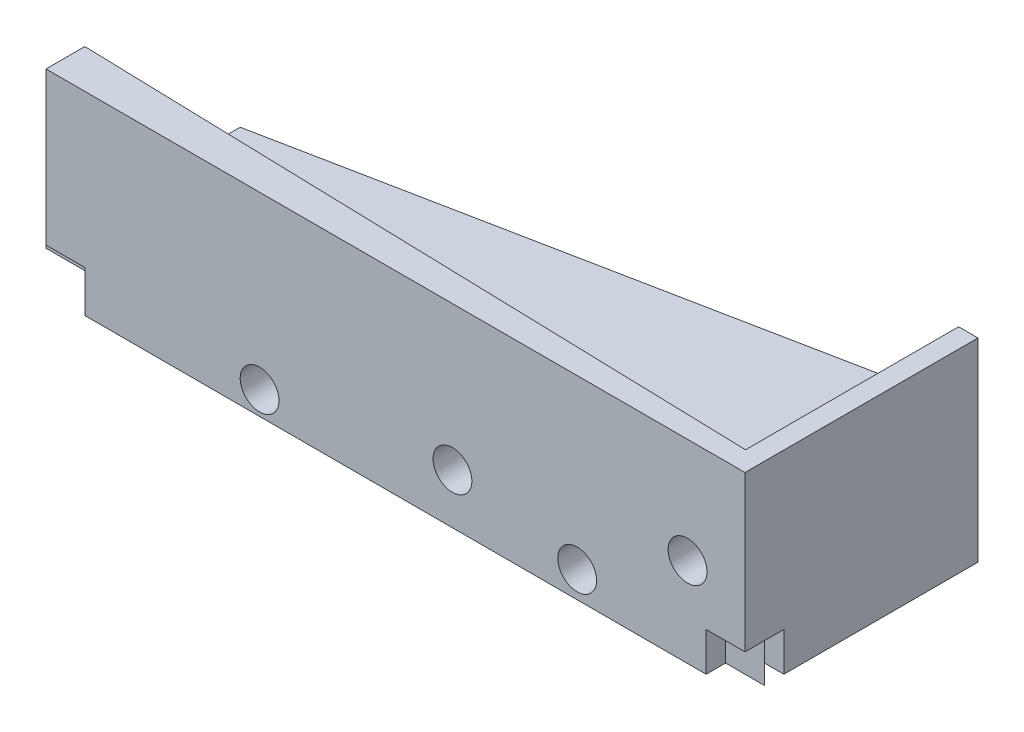
ISO-10303-21;
HEADER;
FILE_DESCRIPTION(('STEP AP214'),'2;1');
FILE_NAME('part.step','',(''),(''),'','','');
FILE_SCHEMA(('AUTOMOTIVE_DESIGN { 1 0 10303 214 1 1 1 1 }'));
ENDSEC;
DATA;
#1=APPLICATION_CONTEXT('core data for automotive mechanical design processes');
#2=APPLICATION_PROTOCOL_DEFINITION('international standard','automotive_design',2000,#1);
#3=PRODUCT_CONTEXT('',#1,'mechanical');
#4=PRODUCT('Part','Part','',(#3));
#5=PRODUCT_RELATED_PRODUCT_CATEGORY('part','',(#4));
#6=PRODUCT_DEFINITION_FORMATION('','',#4);
#7=PRODUCT_DEFINITION_CONTEXT('part definition',#1,'design');
#8=PRODUCT_DEFINITION('design','',#6,#7);
#9=PRODUCT_DEFINITION_SHAPE('','',#8);
#10=(LENGTH_UNIT() NAMED_UNIT(*) SI_UNIT(.MILLI.,.METRE.));
#11=(NAMED_UNIT(*) PLANE_ANGLE_UNIT() SI_UNIT($,.RADIAN.));
#12=(NAMED_UNIT(*) SI_UNIT($,.STERADIAN.) SOLID_ANGLE_UNIT());
#13=UNCERTAINTY_MEASURE_WITH_UNIT(LENGTH_MEASURE(1.E-05),#10,'distance_accuracy_value','');
#14=(GEOMETRIC_REPRESENTATION_CONTEXT(3) GLOBAL_UNCERTAINTY_ASSIGNED_CONTEXT((#13)) GLOBAL_UNIT_ASSIGNED_CONTEXT((#10,
#11,#12)) REPRESENTATION_CONTEXT('',''));
#15=CARTESIAN_POINT('',(0.,0.,0.));
#16=DIRECTION('',(0.,0.,1.));
#17=DIRECTION('',(1.,0.,0.));
#18=AXIS2_PLACEMENT_3D('',#15,#16,#17);
#19=CARTESIAN_POINT('',(-40.7960134047091,6.,200.));
#20=DIRECTION('',(0.,0.,-1.));
#21=DIRECTION('',(-1.,0.,0.));
#22=AXIS2_PLACEMENT_3D('',#19,#20,#21);
#23=CYLINDRICAL_SURFACE('',#22,3.);
#24=CARTESIAN_POINT('',(-40.7960134047091,6.,145.));
#25=DIRECTION('',(0.,0.,1.));
#26=DIRECTION('',(1.,0.,0.));
#27=AXIS2_PLACEMENT_3D('',#24,#25,#26);
#28=CIRCLE('',#27,3.);
#29=CARTESIAN_POINT('',(-37.7960134047091,6.,145.));
#30=VERTEX_POINT('',#29);
#31=EDGE_CURVE('E363',#30,#30,#28,.T.);
#32=ORIENTED_EDGE('',*,*,#31,.F.);
#33=EDGE_LOOP('',(#32));
#34=FACE_BOUND('',#33,.T.);
#35=CARTESIAN_POINT('',(-40.7960134047091,6.,190.));
#36=DIRECTION('',(0.,0.,1.));
#37=DIRECTION('',(1.,0.,0.));
#38=AXIS2_PLACEMENT_3D('',#35,#36,#37);
#39=CIRCLE('',#38,3.);
#40=CARTESIAN_POINT('',(-37.7960134047091,6.,190.));
#41=VERTEX_POINT('',#40);
#42=EDGE_CURVE('E217',#41,#41,#39,.T.);
#43=ORIENTED_EDGE('',*,*,#42,.T.);
#44=EDGE_LOOP('',(#43));
#45=FACE_BOUND('',#44,.T.);
#46=ADVANCED_FACE('F35',(#34,#45),#23,.F.);
#47=CARTESIAN_POINT('',(8.86154286614935,12.9010851063287,200.));
#48=DIRECTION('',(0.,0.,-1.));
#49=DIRECTION('',(-1.,0.,0.));
#50=AXIS2_PLACEMENT_3D('',#47,#48,#49);
#51=CYLINDRICAL_SURFACE('',#50,3.);
#52=CARTESIAN_POINT('',(8.86154286614935,12.9010851063287,145.));
#53=DIRECTION('',(0.,0.,1.));
#54=DIRECTION('',(1.,0.,0.));
#55=AXIS2_PLACEMENT_3D('',#52,#53,#54);
#56=CIRCLE('',#55,3.);
#57=CARTESIAN_POINT('',(11.8615428661494,12.9010851063287,145.));
#58=VERTEX_POINT('',#57);
#59=EDGE_CURVE('E360',#58,#58,#56,.T.);
#60=ORIENTED_EDGE('',*,*,#59,.F.);
#61=EDGE_LOOP('',(#60));
#62=FACE_BOUND('',#61,.T.);
#63=CARTESIAN_POINT('',(8.86154286614935,12.9010851063287,190.));
#64=DIRECTION('',(0.,0.,1.));
#65=DIRECTION('',(1.,0.,0.));
#66=AXIS2_PLACEMENT_3D('',#63,#64,#65);
#67=CIRCLE('',#66,3.);
#68=CARTESIAN_POINT('',(11.8615428661494,12.9010851063287,190.));
#69=VERTEX_POINT('',#68);
#70=EDGE_CURVE('E212',#69,#69,#67,.T.);
#71=ORIENTED_EDGE('',*,*,#70,.T.);
#72=EDGE_LOOP('',(#71));
#73=FACE_BOUND('',#72,.T.);
#74=ADVANCED_FACE('F403',(#62,#73),#51,.F.);
#75=CARTESIAN_POINT('',(40.9814690667464,6.77616521020496,200.));
#76=DIRECTION('',(0.,0.,-1.));
#77=DIRECTION('',(-1.,0.,0.));
#78=AXIS2_PLACEMENT_3D('',#75,#76,#77);
#79=CYLINDRICAL_SURFACE('',#78,3.00000000000001);
#80=CARTESIAN_POINT('',(40.9814690667464,6.77616521020496,145.));
#81=DIRECTION('',(0.,0.,1.));
#82=DIRECTION('',(1.,0.,0.));
#83=AXIS2_PLACEMENT_3D('',#80,#81,#82);
#84=CIRCLE('',#83,3.00000000000001);
#85=CARTESIAN_POINT('',(43.9814690667464,6.77616521020496,145.));
#86=VERTEX_POINT('',#85);
#87=EDGE_CURVE('E353',#86,#86,#84,.T.);
#88=ORIENTED_EDGE('',*,*,#87,.F.);
#89=EDGE_LOOP('',(#88));
#90=FACE_BOUND('',#89,.T.);
#91=CARTESIAN_POINT('',(40.9814690667464,6.77616521020496,190.));
#92=DIRECTION('',(0.,0.,1.));
#93=DIRECTION('',(1.,0.,0.));
#94=AXIS2_PLACEMENT_3D('',#91,#92,#93);
#95=CIRCLE('',#94,3.00000000000001);
#96=CARTESIAN_POINT('',(43.9814690667464,6.77616521020496,190.));
#97=VERTEX_POINT('',#96);
#98=EDGE_CURVE('E207',#97,#97,#95,.T.);
#99=ORIENTED_EDGE('',*,*,#98,.T.);
#100=EDGE_LOOP('',(#99));
#101=FACE_BOUND('',#100,.T.);
#102=ADVANCED_FACE('F410',(#90,#101),#79,.F.);
#103=CARTESIAN_POINT('',(69.4060048708337,22.9393971638675,200.));
#104=DIRECTION('',(0.,0.,-1.));
#105=DIRECTION('',(-1.,0.,0.));
#106=AXIS2_PLACEMENT_3D('',#103,#104,#105);
#107=CYLINDRICAL_SURFACE('',#106,3.00000000000001);
#108=CARTESIAN_POINT('',(69.4060048708337,22.9393971638675,145.));
#109=DIRECTION('',(0.,0.,1.));
#110=DIRECTION('',(1.,0.,0.));
#111=AXIS2_PLACEMENT_3D('',#108,#109,#110);
#112=CIRCLE('',#111,3.00000000000001);
#113=CARTESIAN_POINT('',(72.4060048708337,22.9393971638675,145.));
#114=VERTEX_POINT('',#113);
#115=EDGE_CURVE('E350',#114,#114,#112,.T.);
#116=ORIENTED_EDGE('',*,*,#115,.F.);
#117=EDGE_LOOP('',(#116));
#118=FACE_BOUND('',#117,.T.);
#119=CARTESIAN_POINT('',(69.4060048708337,22.9393971638675,190.));
#120=DIRECTION('',(0.,0.,1.));
#121=DIRECTION('',(1.,0.,0.));
#122=AXIS2_PLACEMENT_3D('',#119,#120,#121);
#123=CIRCLE('',#122,3.00000000000001);
#124=CARTESIAN_POINT('',(72.4060048708337,22.9393971638675,190.));
#125=VERTEX_POINT('',#124);
#126=EDGE_CURVE('E202',#125,#125,#123,.T.);
#127=ORIENTED_EDGE('',*,*,#126,.T.);
#128=EDGE_LOOP('',(#127));
#129=FACE_BOUND('',#128,.T.);
#130=ADVANCED_FACE('F419',(#118,#129),#107,.F.);
#131=CARTESIAN_POINT('',(-105.796013404709,2.,200.));
#132=DIRECTION('',(0.163567680624933,-0.986532114963816,0.));
#133=DIRECTION('',(0.986532114963816,0.163567680624933,0.));
#134=AXIS2_PLACEMENT_3D('',#131,#132,#133);
#135=PLANE('',#134);
#136=DIRECTION('',(0.,0.,-1.));
#137=VECTOR('',#136,1.);
#138=CARTESIAN_POINT('',(79.2039865952909,32.6731230100121,217.967909160371));
#139=LINE('',#138,#137);
#140=CARTESIAN_POINT('',(79.2039865952909,32.6731230100121,199.861111111111));
#141=VERTEX_POINT('',#140);
#142=CARTESIAN_POINT('',(79.2039865952909,32.6731230100121,145.));
#143=VERTEX_POINT('',#142);
#144=EDGE_CURVE('E349',#141,#143,#139,.T.);
#145=ORIENTED_EDGE('',*,*,#144,.T.);
#146=DIRECTION('',(-0.986532114963816,-0.163567680624933,0.));
#147=VECTOR('',#146,1.);
#148=CARTESIAN_POINT('',(-105.796013404709,2.,145.));
#149=LINE('',#148,#147);
#150=CARTESIAN_POINT('',(-105.796013404709,2.,145.));
#151=VERTEX_POINT('',#150);
#152=EDGE_CURVE('E49',#143,#151,#149,.T.);
#153=ORIENTED_EDGE('',*,*,#152,.T.);
#154=DIRECTION('',(0.,0.,-1.));
#155=VECTOR('',#154,1.);
#156=CARTESIAN_POINT('',(-105.796013404709,2.,200.));
#157=LINE('',#156,#155);
#158=CARTESIAN_POINT('',(-105.796013404709,2.,195.));
#159=VERTEX_POINT('',#158);
#160=EDGE_CURVE('E191',#159,#151,#157,.T.);
#161=ORIENTED_EDGE('',*,*,#160,.F.);
#162=DIRECTION('',(-0.986532114963816,-0.163567680624933,0.));
#163=VECTOR('',#162,1.);
#164=CARTESIAN_POINT('',(-105.796013404709,2.,195.));
#165=LINE('',#164,#163);
#166=CARTESIAN_POINT('',(-85.7960134047091,5.31601329837969,195.));
#167=VERTEX_POINT('',#166);
#168=EDGE_CURVE('E278',#167,#159,#165,.T.);
#169=ORIENTED_EDGE('',*,*,#168,.F.);
#170=DIRECTION('',(0.,0.,-1.));
#171=VECTOR('',#170,1.);
#172=CARTESIAN_POINT('',(-85.7960134047091,5.31601329837969,200.));
#173=LINE('',#172,#171);
#174=CARTESIAN_POINT('',(-85.7960134047091,5.31601329837969,195.277777777778));
#175=VERTEX_POINT('',#174);
#176=EDGE_CURVE('E274',#175,#167,#173,.T.);
#177=ORIENTED_EDGE('',*,*,#176,.F.);
#178=DIRECTION('',(-0.986161899831777,-0.163506298709877,-0.0273933861064383));
#179=VECTOR('',#178,1.);
#180=CARTESIAN_POINT('',(-105.653437860258,2.02363912007125,194.726182654013));
#181=LINE('',#180,#179);
#182=EDGE_CURVE('E221',#141,#175,#181,.T.);
#183=ORIENTED_EDGE('',*,*,#182,.F.);
#184=EDGE_LOOP('',(#145,#153,#161,#169,#177,#183));
#185=FACE_BOUND('',#184,.T.);
#186=ADVANCED_FACE('F347',(#185),#135,.F.);
#187=CARTESIAN_POINT('',(-105.796013404709,0.,200.));
#188=DIRECTION('',(1.,0.,0.));
#189=DIRECTION('',(0.,0.,-1.));
#190=AXIS2_PLACEMENT_3D('',#187,#188,#189);
#191=PLANE('',#190);
#192=ORIENTED_EDGE('',*,*,#160,.T.);
#193=DIRECTION('',(0.,1.,0.));
#194=VECTOR('',#193,1.);
#195=CARTESIAN_POINT('',(-105.796013404709,-242.074368738204,145.));
#196=LINE('',#195,#194);
#197=CARTESIAN_POINT('',(-105.796013404709,0.,145.));
#198=VERTEX_POINT('',#197);
#199=EDGE_CURVE('E160',#198,#151,#196,.T.);
#200=ORIENTED_EDGE('',*,*,#199,.F.);
#201=DIRECTION('',(0.,0.,-1.));
#202=VECTOR('',#201,1.);
#203=CARTESIAN_POINT('',(-105.796013404709,0.,200.));
#204=LINE('',#203,#202);
#205=CARTESIAN_POINT('',(-105.796013404709,0.,195.));
#206=VERTEX_POINT('',#205);
#207=EDGE_CURVE('E196',#206,#198,#204,.T.);
#208=ORIENTED_EDGE('',*,*,#207,.F.);
#209=DIRECTION('',(0.,1.,0.));
#210=VECTOR('',#209,1.);
#211=CARTESIAN_POINT('',(-105.796013404709,0.,195.));
#212=LINE('',#211,#210);
#213=EDGE_CURVE('E339',#206,#159,#212,.T.);
#214=ORIENTED_EDGE('',*,*,#213,.T.);
#215=EDGE_LOOP('',(#192,#200,#208,#214));
#216=FACE_BOUND('',#215,.T.);
#217=ADVANCED_FACE('F37',(#216),#191,.F.);
#218=CARTESIAN_POINT('',(-105.796013404709,0.,200.));
#219=DIRECTION('',(0.,1.,0.));
#220=DIRECTION('',(0.,0.,1.));
#221=AXIS2_PLACEMENT_3D('',#218,#219,#220);
#222=PLANE('',#221);
#223=ORIENTED_EDGE('',*,*,#207,.T.);
#224=DIRECTION('',(-1.,0.,0.));
#225=VECTOR('',#224,1.);
#226=CARTESIAN_POINT('',(84.2039865952909,0.,145.));
#227=LINE('',#226,#225);
#228=CARTESIAN_POINT('',(84.2039865952909,0.,145.));
#229=VERTEX_POINT('',#228);
#230=EDGE_CURVE('E171',#229,#198,#227,.T.);
#231=ORIENTED_EDGE('',*,*,#230,.F.);
#232=DIRECTION('',(0.,0.,-1.));
#233=VECTOR('',#232,1.);
#234=CARTESIAN_POINT('',(84.2039865952909,0.,200.));
#235=LINE('',#234,#233);
#236=CARTESIAN_POINT('',(84.2039865952909,0.,195.));
#237=VERTEX_POINT('',#236);
#238=EDGE_CURVE('E170',#237,#229,#235,.T.);
#239=ORIENTED_EDGE('',*,*,#238,.F.);
#240=DIRECTION('',(1.,0.,0.));
#241=VECTOR('',#240,1.);
#242=CARTESIAN_POINT('',(74.2039865952909,0.,195.));
#243=LINE('',#242,#241);
#244=CARTESIAN_POINT('',(74.2039865952909,0.,195.));
#245=VERTEX_POINT('',#244);
#246=EDGE_CURVE('E249',#245,#237,#243,.T.);
#247=ORIENTED_EDGE('',*,*,#246,.F.);
#248=DIRECTION('',(0.,0.,-1.));
#249=VECTOR('',#248,1.);
#250=CARTESIAN_POINT('',(74.2039865952909,0.,205.));
#251=LINE('',#250,#249);
#252=CARTESIAN_POINT('',(74.2039865952909,0.,199.722222222222));
#253=VERTEX_POINT('',#252);
#254=EDGE_CURVE('E238',#253,#245,#251,.T.);
#255=ORIENTED_EDGE('',*,*,#254,.F.);
#256=DIRECTION('',(-0.999614420652718,0.,-0.0277670672403533));
#257=VECTOR('',#256,1.);
#258=CARTESIAN_POINT('',(-95.7960134047091,0.,195.));
#259=LINE('',#258,#257);
#260=CARTESIAN_POINT('',(84.2039865952909,0.,200.));
#261=VERTEX_POINT('',#260);
#262=EDGE_CURVE('E284',#261,#253,#259,.T.);
#263=ORIENTED_EDGE('',*,*,#262,.F.);
#264=DIRECTION('',(1.,0.,0.));
#265=VECTOR('',#264,1.);
#266=CARTESIAN_POINT('',(84.2039865952909,0.,200.));
#267=LINE('',#266,#265);
#268=CARTESIAN_POINT('',(74.2039865952909,0.,200.));
#269=VERTEX_POINT('',#268);
#270=EDGE_CURVE('E282',#269,#261,#267,.T.);
#271=ORIENTED_EDGE('',*,*,#270,.F.);
#272=CARTESIAN_POINT('',(74.2039865952909,0.,205.));
#273=VERTEX_POINT('',#272);
#274=EDGE_CURVE('E240',#273,#269,#251,.T.);
#275=ORIENTED_EDGE('',*,*,#274,.F.);
#276=DIRECTION('',(1.,0.,0.));
#277=VECTOR('',#276,1.);
#278=CARTESIAN_POINT('',(-95.7960134047091,0.,205.));
#279=LINE('',#278,#277);
#280=CARTESIAN_POINT('',(-85.7960134047091,0.,205.));
#281=VERTEX_POINT('',#280);
#282=EDGE_CURVE('E189',#281,#273,#279,.T.);
#283=ORIENTED_EDGE('',*,*,#282,.F.);
#284=DIRECTION('',(0.,0.,1.));
#285=VECTOR('',#284,1.);
#286=CARTESIAN_POINT('',(-85.7960134047091,0.,195.));
#287=LINE('',#286,#285);
#288=CARTESIAN_POINT('',(-85.7960134047091,0.,195.));
#289=VERTEX_POINT('',#288);
#290=EDGE_CURVE('E325',#289,#281,#287,.T.);
#291=ORIENTED_EDGE('',*,*,#290,.F.);
#292=DIRECTION('',(-1.,0.,0.));
#293=VECTOR('',#292,1.);
#294=CARTESIAN_POINT('',(-105.796013404709,0.,195.));
#295=LINE('',#294,#293);
#296=EDGE_CURVE('E327',#289,#206,#295,.T.);
#297=ORIENTED_EDGE('',*,*,#296,.T.);
#298=EDGE_LOOP('',(#223,#231,#239,#247,#255,#263,#271,#275,#283,#291,#297));
#299=FACE_BOUND('',#298,.T.);
#300=ADVANCED_FACE('F305',(#299),#222,.F.);
#301=CARTESIAN_POINT('',(-95.7960134047091,0.,0.));
#302=DIRECTION('',(1.,0.,0.));
#303=DIRECTION('',(0.,0.,-1.));
#304=AXIS2_PLACEMENT_3D('',#301,#302,#303);
#305=PLANE('',#304);
#306=DIRECTION('',(0.,0.,-1.));
#307=VECTOR('',#306,1.);
#308=CARTESIAN_POINT('',(-95.7960134047091,10.7198341627884,0.));
#309=LINE('',#308,#307);
#310=CARTESIAN_POINT('',(-95.7960134047091,10.7198341627884,205.));
#311=VERTEX_POINT('',#310);
#312=CARTESIAN_POINT('',(-95.7960134047091,10.7198341627884,195.));
#313=VERTEX_POINT('',#312);
#314=EDGE_CURVE('E269',#311,#313,#309,.T.);
#315=ORIENTED_EDGE('',*,*,#314,.F.);
#316=DIRECTION('',(0.,-1.,0.));
#317=VECTOR('',#316,1.);
#318=CARTESIAN_POINT('',(-95.7960134047091,0.,205.));
#319=LINE('',#318,#317);
#320=CARTESIAN_POINT('',(-95.7960134047091,50.,205.));
#321=VERTEX_POINT('',#320);
#322=EDGE_CURVE('E186',#321,#311,#319,.T.);
#323=ORIENTED_EDGE('',*,*,#322,.F.);
#324=DIRECTION('',(0.,0.,1.));
#325=VECTOR('',#324,1.);
#326=CARTESIAN_POINT('',(-95.7960134047091,50.,200.));
#327=LINE('',#326,#325);
#328=CARTESIAN_POINT('',(-95.7960134047091,50.,195.));
#329=VERTEX_POINT('',#328);
#330=EDGE_CURVE('E180',#329,#321,#327,.T.);
#331=ORIENTED_EDGE('',*,*,#330,.F.);
#332=DIRECTION('',(0.,1.,0.));
#333=VECTOR('',#332,1.);
#334=CARTESIAN_POINT('',(-95.7960134047091,-180.069431053691,195.));
#335=LINE('',#334,#333);
#336=EDGE_CURVE('E270',#313,#329,#335,.T.);
#337=ORIENTED_EDGE('',*,*,#336,.F.);
#338=EDGE_LOOP('',(#315,#323,#331,#337));
#339=FACE_BOUND('',#338,.T.);
#340=ADVANCED_FACE('F267',(#339),#305,.F.);
#341=CARTESIAN_POINT('',(-95.7960134047091,0.,205.));
#342=DIRECTION('',(0.,0.,1.));
#343=DIRECTION('',(1.,0.,0.));
#344=AXIS2_PLACEMENT_3D('',#341,#342,#343);
#345=PLANE('',#344);
#346=CARTESIAN_POINT('',(-40.7960134047091,6.,205.));
#347=DIRECTION('',(0.,0.,-1.));
#348=DIRECTION('',(-1.,0.,0.));
#349=AXIS2_PLACEMENT_3D('',#346,#347,#348);
#350=CIRCLE('',#349,5.);
#351=CARTESIAN_POINT('',(-45.7960134047091,6.,205.));
#352=VERTEX_POINT('',#351);
#353=EDGE_CURVE('E371',#352,#352,#350,.T.);
#354=ORIENTED_EDGE('',*,*,#353,.T.);
#355=EDGE_LOOP('',(#354));
#356=FACE_BOUND('',#355,.T.);
#357=CARTESIAN_POINT('',(8.86154286614935,12.9010851063287,205.));
#358=DIRECTION('',(0.,0.,-1.));
#359=DIRECTION('',(-1.,0.,0.));
#360=AXIS2_PLACEMENT_3D('',#357,#358,#359);
#361=CIRCLE('',#360,5.);
#362=CARTESIAN_POINT('',(3.86154286614935,12.9010851063287,205.));
#363=VERTEX_POINT('',#362);
#364=EDGE_CURVE('E219',#363,#363,#361,.T.);
#365=ORIENTED_EDGE('',*,*,#364,.T.);
#366=EDGE_LOOP('',(#365));
#367=FACE_BOUND('',#366,.T.);
#368=CARTESIAN_POINT('',(40.9814690667464,6.77616521020496,205.));
#369=DIRECTION('',(0.,0.,-1.));
#370=DIRECTION('',(-1.,0.,0.));
#371=AXIS2_PLACEMENT_3D('',#368,#369,#370);
#372=CIRCLE('',#371,5.);
#373=CARTESIAN_POINT('',(35.9814690667464,6.77616521020496,205.));
#374=VERTEX_POINT('',#373);
#375=EDGE_CURVE('E215',#374,#374,#372,.T.);
#376=ORIENTED_EDGE('',*,*,#375,.T.);
#377=EDGE_LOOP('',(#376));
#378=FACE_BOUND('',#377,.T.);
#379=CARTESIAN_POINT('',(69.4060048708337,22.9393971638675,205.));
#380=DIRECTION('',(0.,0.,-1.));
#381=DIRECTION('',(-1.,0.,0.));
#382=AXIS2_PLACEMENT_3D('',#379,#380,#381);
#383=CIRCLE('',#382,5.);
#384=CARTESIAN_POINT('',(64.4060048708336,22.9393971638675,205.));
#385=VERTEX_POINT('',#384);
#386=EDGE_CURVE('E210',#385,#385,#383,.T.);
#387=ORIENTED_EDGE('',*,*,#386,.T.);
#388=EDGE_LOOP('',(#387));
#389=FACE_BOUND('',#388,.T.);
#390=ORIENTED_EDGE('',*,*,#322,.T.);
#391=DIRECTION('',(1.,0.,0.));
#392=VECTOR('',#391,1.);
#393=CARTESIAN_POINT('',(-105.796013404709,10.7198341627884,205.));
#394=LINE('',#393,#392);
#395=CARTESIAN_POINT('',(-85.7960134047091,10.7198341627884,205.));
#396=VERTEX_POINT('',#395);
#397=EDGE_CURVE('E264',#311,#396,#394,.T.);
#398=ORIENTED_EDGE('',*,*,#397,.T.);
#399=DIRECTION('',(0.,-1.,0.));
#400=VECTOR('',#399,1.);
#401=CARTESIAN_POINT('',(-85.7960134047091,0.,205.));
#402=LINE('',#401,#400);
#403=EDGE_CURVE('E205',#396,#281,#402,.T.);
#404=ORIENTED_EDGE('',*,*,#403,.T.);
#405=ORIENTED_EDGE('',*,*,#282,.T.);
#406=DIRECTION('',(0.,-1.,0.));
#407=VECTOR('',#406,1.);
#408=CARTESIAN_POINT('',(74.2039865952909,0.,205.));
#409=LINE('',#408,#407);
#410=CARTESIAN_POINT('',(74.2039865952909,10.,205.));
#411=VERTEX_POINT('',#410);
#412=EDGE_CURVE('E235',#411,#273,#409,.T.);
#413=ORIENTED_EDGE('',*,*,#412,.F.);
#414=DIRECTION('',(1.,0.,0.));
#415=VECTOR('',#414,1.);
#416=CARTESIAN_POINT('',(74.2039865952909,10.,205.));
#417=LINE('',#416,#415);
#418=CARTESIAN_POINT('',(84.2039865952909,10.,205.));
#419=VERTEX_POINT('',#418);
#420=EDGE_CURVE('E178',#411,#419,#417,.T.);
#421=ORIENTED_EDGE('',*,*,#420,.T.);
#422=DIRECTION('',(0.,-1.,0.));
#423=VECTOR('',#422,1.);
#424=CARTESIAN_POINT('',(84.2039865952909,0.,205.));
#425=LINE('',#424,#423);
#426=CARTESIAN_POINT('',(84.2039865952909,50.,205.));
#427=VERTEX_POINT('',#426);
#428=EDGE_CURVE('E177',#427,#419,#425,.T.);
#429=ORIENTED_EDGE('',*,*,#428,.F.);
#430=DIRECTION('',(1.,0.,0.));
#431=VECTOR('',#430,1.);
#432=CARTESIAN_POINT('',(-95.7960134047091,50.,205.));
#433=LINE('',#432,#431);
#434=EDGE_CURVE('E175',#321,#427,#433,.T.);
#435=ORIENTED_EDGE('',*,*,#434,.F.);
#436=EDGE_LOOP('',(#390,#398,#404,#405,#413,#421,#429,#435));
#437=FACE_BOUND('',#436,.T.);
#438=ADVANCED_FACE('F262',(#356,#367,#378,#389,#437),#345,.T.);
#439=CARTESIAN_POINT('',(-95.7960134047091,-180.069431053691,195.));
#440=DIRECTION('',(-0.0277670672403533,0.,0.999614420652718));
#441=DIRECTION('',(0.999614420652718,0.,0.0277670672403533));
#442=AXIS2_PLACEMENT_3D('',#439,#440,#441);
#443=PLANE('',#442);
#444=DIRECTION('',(0.999614420652718,0.,0.0277670672403533));
#445=VECTOR('',#444,1.);
#446=CARTESIAN_POINT('',(-95.7960134047091,50.,195.));
#447=LINE('',#446,#445);
#448=CARTESIAN_POINT('',(79.2039865952909,50.,199.861111111111));
#449=VERTEX_POINT('',#448);
#450=EDGE_CURVE('E273',#329,#449,#447,.T.);
#451=ORIENTED_EDGE('',*,*,#450,.T.);
#452=DIRECTION('',(0.,1.,0.));
#453=VECTOR('',#452,1.);
#454=CARTESIAN_POINT('',(79.2039865952909,32.6731230100121,199.861111111111));
#455=LINE('',#454,#453);
#456=EDGE_CURVE('E366',#141,#449,#455,.T.);
#457=ORIENTED_EDGE('',*,*,#456,.F.);
#458=ORIENTED_EDGE('',*,*,#182,.T.);
#459=DIRECTION('',(0.,-1.,0.));
#460=VECTOR('',#459,1.);
#461=CARTESIAN_POINT('',(-85.7960134047091,-180.069431053691,195.277777777778));
#462=LINE('',#461,#460);
#463=CARTESIAN_POINT('',(-85.7960134047091,10.7198341627884,195.277777777778));
#464=VERTEX_POINT('',#463);
#465=EDGE_CURVE('E199',#464,#175,#462,.T.);
#466=ORIENTED_EDGE('',*,*,#465,.F.);
#467=DIRECTION('',(0.999614420652718,0.,0.0277670672403533));
#468=VECTOR('',#467,1.);
#469=CARTESIAN_POINT('',(-95.7960134047091,10.7198341627884,195.));
#470=LINE('',#469,#468);
#471=EDGE_CURVE('E43',#313,#464,#470,.T.);
#472=ORIENTED_EDGE('',*,*,#471,.F.);
#473=ORIENTED_EDGE('',*,*,#336,.T.);
#474=EDGE_LOOP('',(#451,#457,#458,#466,#472,#473));
#475=FACE_BOUND('',#474,.T.);
#476=ADVANCED_FACE('F579',(#475),#443,.F.);
#477=CARTESIAN_POINT('',(74.2039865952909,10.,205.));
#478=DIRECTION('',(0.,1.,0.));
#479=DIRECTION('',(0.,0.,1.));
#480=AXIS2_PLACEMENT_3D('',#477,#478,#479);
#481=PLANE('',#480);
#482=DIRECTION('',(-1.,0.,0.));
#483=VECTOR('',#482,1.);
#484=CARTESIAN_POINT('',(74.2039865952909,10.,200.));
#485=LINE('',#484,#483);
#486=CARTESIAN_POINT('',(84.2039865952909,10.,200.));
#487=VERTEX_POINT('',#486);
#488=CARTESIAN_POINT('',(74.2039865952909,10.,200.));
#489=VERTEX_POINT('',#488);
#490=EDGE_CURVE('E231',#487,#489,#485,.T.);
#491=ORIENTED_EDGE('',*,*,#490,.F.);
#492=DIRECTION('',(0.,0.,1.));
#493=VECTOR('',#492,1.);
#494=CARTESIAN_POINT('',(84.2039865952909,10.,205.));
#495=LINE('',#494,#493);
#496=EDGE_CURVE('E252',#487,#419,#495,.T.);
#497=ORIENTED_EDGE('',*,*,#496,.T.);
#498=ORIENTED_EDGE('',*,*,#420,.F.);
#499=DIRECTION('',(0.,0.,1.));
#500=VECTOR('',#499,1.);
#501=CARTESIAN_POINT('',(74.2039865952909,10.,205.));
#502=LINE('',#501,#500);
#503=EDGE_CURVE('E245',#489,#411,#502,.T.);
#504=ORIENTED_EDGE('',*,*,#503,.F.);
#505=EDGE_LOOP('',(#491,#497,#498,#504));
#506=FACE_BOUND('',#505,.T.);
#507=ADVANCED_FACE('F317',(#506),#481,.F.);
#508=DIRECTION('',(0.999614420652718,0.,0.0277670672403533));
#509=VECTOR('',#508,1.);
#510=CARTESIAN_POINT('',(74.3504784996857,10.,199.726291441789));
#511=LINE('',#510,#509);
#512=CARTESIAN_POINT('',(74.2039865952909,10.,199.722222222222));
#513=VERTEX_POINT('',#512);
#514=EDGE_CURVE('E224',#513,#487,#511,.T.);
#515=ORIENTED_EDGE('',*,*,#514,.F.);
#516=CARTESIAN_POINT('',(74.2039865952909,10.,195.));
#517=VERTEX_POINT('',#516);
#518=EDGE_CURVE('E246',#517,#513,#502,.T.);
#519=ORIENTED_EDGE('',*,*,#518,.F.);
#520=DIRECTION('',(1.,0.,0.));
#521=VECTOR('',#520,1.);
#522=CARTESIAN_POINT('',(74.2039865952909,10.,195.));
#523=LINE('',#522,#521);
#524=CARTESIAN_POINT('',(84.2039865952909,10.,195.));
#525=VERTEX_POINT('',#524);
#526=EDGE_CURVE('E183',#517,#525,#523,.T.);
#527=ORIENTED_EDGE('',*,*,#526,.T.);
#528=EDGE_CURVE('E239',#525,#487,#495,.T.);
#529=ORIENTED_EDGE('',*,*,#528,.T.);
#530=EDGE_LOOP('',(#515,#519,#527,#529));
#531=FACE_BOUND('',#530,.T.);
#532=ADVANCED_FACE('F310',(#531),#481,.F.);
#533=CARTESIAN_POINT('',(74.2039865952909,0.,0.));
#534=DIRECTION('',(-1.,0.,0.));
#535=DIRECTION('',(0.,0.,1.));
#536=AXIS2_PLACEMENT_3D('',#533,#534,#535);
#537=PLANE('',#536);
#538=DIRECTION('',(0.,-1.,0.));
#539=VECTOR('',#538,1.);
#540=CARTESIAN_POINT('',(74.2039865952909,0.,200.));
#541=LINE('',#540,#539);
#542=EDGE_CURVE('E223',#489,#269,#541,.T.);
#543=ORIENTED_EDGE('',*,*,#542,.F.);
#544=ORIENTED_EDGE('',*,*,#503,.T.);
#545=ORIENTED_EDGE('',*,*,#412,.T.);
#546=ORIENTED_EDGE('',*,*,#274,.T.);
#547=EDGE_LOOP('',(#543,#544,#545,#546));
#548=FACE_BOUND('',#547,.T.);
#549=ADVANCED_FACE('F322',(#548),#537,.F.);
#550=DIRECTION('',(0.,1.,0.));
#551=VECTOR('',#550,1.);
#552=CARTESIAN_POINT('',(74.2039865952909,0.,199.722222222222));
#553=LINE('',#552,#551);
#554=EDGE_CURVE('E287',#253,#513,#553,.T.);
#555=ORIENTED_EDGE('',*,*,#554,.F.);
#556=ORIENTED_EDGE('',*,*,#254,.T.);
#557=DIRECTION('',(0.,1.,0.));
#558=VECTOR('',#557,1.);
#559=CARTESIAN_POINT('',(74.2039865952909,0.,195.));
#560=LINE('',#559,#558);
#561=EDGE_CURVE('E242',#245,#517,#560,.T.);
#562=ORIENTED_EDGE('',*,*,#561,.T.);
#563=ORIENTED_EDGE('',*,*,#518,.T.);
#564=EDGE_LOOP('',(#555,#556,#562,#563));
#565=FACE_BOUND('',#564,.T.);
#566=ADVANCED_FACE('F309',(#565),#537,.F.);
#567=CARTESIAN_POINT('',(84.2039865952909,0.,200.));
#568=DIRECTION('',(-1.,0.,0.));
#569=DIRECTION('',(0.,0.,1.));
#570=AXIS2_PLACEMENT_3D('',#567,#568,#569);
#571=PLANE('',#570);
#572=ORIENTED_EDGE('',*,*,#238,.T.);
#573=DIRECTION('',(0.,1.,0.));
#574=VECTOR('',#573,1.);
#575=CARTESIAN_POINT('',(84.2039865952909,-242.074368738204,145.));
#576=LINE('',#575,#574);
#577=CARTESIAN_POINT('',(84.2039865952909,50.,145.));
#578=VERTEX_POINT('',#577);
#579=EDGE_CURVE('E155',#229,#578,#576,.T.);
#580=ORIENTED_EDGE('',*,*,#579,.T.);
#581=DIRECTION('',(0.,0.,1.));
#582=VECTOR('',#581,1.);
#583=CARTESIAN_POINT('',(84.2039865952909,50.,200.));
#584=LINE('',#583,#582);
#585=EDGE_CURVE('E166',#578,#427,#584,.T.);
#586=ORIENTED_EDGE('',*,*,#585,.T.);
#587=ORIENTED_EDGE('',*,*,#428,.T.);
#588=ORIENTED_EDGE('',*,*,#496,.F.);
#589=ORIENTED_EDGE('',*,*,#528,.F.);
#590=DIRECTION('',(0.,1.,0.));
#591=VECTOR('',#590,1.);
#592=CARTESIAN_POINT('',(84.2039865952909,0.,195.));
#593=LINE('',#592,#591);
#594=EDGE_CURVE('E234',#237,#525,#593,.T.);
#595=ORIENTED_EDGE('',*,*,#594,.F.);
#596=EDGE_LOOP('',(#572,#580,#586,#587,#588,#589,#595));
#597=FACE_BOUND('',#596,.T.);
#598=ADVANCED_FACE('F164',(#597),#571,.F.);
#599=CARTESIAN_POINT('',(-95.7960134047091,50.,200.));
#600=DIRECTION('',(0.,1.,0.));
#601=DIRECTION('',(0.,0.,1.));
#602=AXIS2_PLACEMENT_3D('',#599,#600,#601);
#603=PLANE('',#602);
#604=DIRECTION('',(1.,0.,0.));
#605=VECTOR('',#604,1.);
#606=CARTESIAN_POINT('',(84.2039865952909,50.,145.));
#607=LINE('',#606,#605);
#608=CARTESIAN_POINT('',(79.2039865952909,50.,145.));
#609=VERTEX_POINT('',#608);
#610=EDGE_CURVE('E152',#609,#578,#607,.T.);
#611=ORIENTED_EDGE('',*,*,#610,.F.);
#612=DIRECTION('',(0.,0.,-1.));
#613=VECTOR('',#612,1.);
#614=CARTESIAN_POINT('',(79.2039865952909,50.,217.967909160371));
#615=LINE('',#614,#613);
#616=EDGE_CURVE('E369',#449,#609,#615,.T.);
#617=ORIENTED_EDGE('',*,*,#616,.F.);
#618=ORIENTED_EDGE('',*,*,#450,.F.);
#619=ORIENTED_EDGE('',*,*,#330,.T.);
#620=ORIENTED_EDGE('',*,*,#434,.T.);
#621=ORIENTED_EDGE('',*,*,#585,.F.);
#622=EDGE_LOOP('',(#611,#617,#618,#619,#620,#621));
#623=FACE_BOUND('',#622,.T.);
#624=ADVANCED_FACE('F173',(#623),#603,.T.);
#625=CARTESIAN_POINT('',(74.2039865952909,0.,195.));
#626=DIRECTION('',(0.,0.,-1.));
#627=DIRECTION('',(-1.,0.,0.));
#628=AXIS2_PLACEMENT_3D('',#625,#626,#627);
#629=PLANE('',#628);
#630=ORIENTED_EDGE('',*,*,#594,.T.);
#631=ORIENTED_EDGE('',*,*,#526,.F.);
#632=ORIENTED_EDGE('',*,*,#561,.F.);
#633=ORIENTED_EDGE('',*,*,#246,.T.);
#634=EDGE_LOOP('',(#630,#631,#632,#633));
#635=FACE_BOUND('',#634,.T.);
#636=ADVANCED_FACE('F313',(#635),#629,.F.);
#637=ORIENTED_EDGE('',*,*,#554,.T.);
#638=ORIENTED_EDGE('',*,*,#514,.T.);
#639=DIRECTION('',(0.,1.,0.));
#640=VECTOR('',#639,1.);
#641=CARTESIAN_POINT('',(84.2039865952909,-180.069431053691,200.));
#642=LINE('',#641,#640);
#643=EDGE_CURVE('E285',#261,#487,#642,.T.);
#644=ORIENTED_EDGE('',*,*,#643,.F.);
#645=ORIENTED_EDGE('',*,*,#262,.T.);
#646=EDGE_LOOP('',(#637,#638,#644,#645));
#647=FACE_BOUND('',#646,.T.);
#648=ADVANCED_FACE('F296',(#647),#443,.F.);
#649=CARTESIAN_POINT('',(84.2039865952909,-180.069431053691,200.));
#650=DIRECTION('',(0.,0.,-1.));
#651=DIRECTION('',(-1.,0.,0.));
#652=AXIS2_PLACEMENT_3D('',#649,#650,#651);
#653=PLANE('',#652);
#654=ORIENTED_EDGE('',*,*,#643,.T.);
#655=ORIENTED_EDGE('',*,*,#490,.T.);
#656=ORIENTED_EDGE('',*,*,#542,.T.);
#657=ORIENTED_EDGE('',*,*,#270,.T.);
#658=EDGE_LOOP('',(#654,#655,#656,#657));
#659=FACE_BOUND('',#658,.T.);
#660=ADVANCED_FACE('F300',(#659),#653,.F.);
#661=CARTESIAN_POINT('',(-105.796013404709,10.7198341627884,195.));
#662=DIRECTION('',(0.,-1.,0.));
#663=DIRECTION('',(0.,0.,-1.));
#664=AXIS2_PLACEMENT_3D('',#661,#662,#663);
#665=PLANE('',#664);
#666=ORIENTED_EDGE('',*,*,#314,.T.);
#667=ORIENTED_EDGE('',*,*,#471,.T.);
#668=DIRECTION('',(0.,0.,1.));
#669=VECTOR('',#668,1.);
#670=CARTESIAN_POINT('',(-85.7960134047091,10.7198341627884,195.));
#671=LINE('',#670,#669);
#672=EDGE_CURVE('E57',#464,#396,#671,.T.);
#673=ORIENTED_EDGE('',*,*,#672,.T.);
#674=ORIENTED_EDGE('',*,*,#397,.F.);
#675=EDGE_LOOP('',(#666,#667,#673,#674));
#676=FACE_BOUND('',#675,.T.);
#677=ADVANCED_FACE('F392',(#676),#665,.T.);
#678=CARTESIAN_POINT('',(-85.7960134047091,0.,195.));
#679=DIRECTION('',(-1.,0.,0.));
#680=DIRECTION('',(0.,0.,1.));
#681=AXIS2_PLACEMENT_3D('',#678,#679,#680);
#682=PLANE('',#681);
#683=ORIENTED_EDGE('',*,*,#176,.T.);
#684=DIRECTION('',(0.,-1.,0.));
#685=VECTOR('',#684,1.);
#686=CARTESIAN_POINT('',(-85.7960134047091,0.,195.));
#687=LINE('',#686,#685);
#688=EDGE_CURVE('E329',#167,#289,#687,.T.);
#689=ORIENTED_EDGE('',*,*,#688,.T.);
#690=ORIENTED_EDGE('',*,*,#290,.T.);
#691=ORIENTED_EDGE('',*,*,#403,.F.);
#692=ORIENTED_EDGE('',*,*,#672,.F.);
#693=ORIENTED_EDGE('',*,*,#465,.T.);
#694=EDGE_LOOP('',(#683,#689,#690,#691,#692,#693));
#695=FACE_BOUND('',#694,.T.);
#696=ADVANCED_FACE('F390',(#695),#682,.T.);
#697=CARTESIAN_POINT('',(0.,0.,195.));
#698=DIRECTION('',(0.,0.,1.));
#699=DIRECTION('',(-1.,0.,0.));
#700=AXIS2_PLACEMENT_3D('',#697,#698,#699);
#701=PLANE('',#700);
#702=ORIENTED_EDGE('',*,*,#168,.T.);
#703=ORIENTED_EDGE('',*,*,#213,.F.);
#704=ORIENTED_EDGE('',*,*,#296,.F.);
#705=ORIENTED_EDGE('',*,*,#688,.F.);
#706=EDGE_LOOP('',(#702,#703,#704,#705));
#707=FACE_BOUND('',#706,.T.);
#708=ADVANCED_FACE('F338',(#707),#701,.T.);
#709=CARTESIAN_POINT('',(69.4060048708337,22.9393971638675,190.));
#710=DIRECTION('',(0.,0.,1.));
#711=DIRECTION('',(1.,0.,0.));
#712=AXIS2_PLACEMENT_3D('',#709,#710,#711);
#713=CYLINDRICAL_SURFACE('',#712,5.);
#714=CARTESIAN_POINT('',(69.4060048708337,22.9393971638675,190.));
#715=DIRECTION('',(0.,0.,-1.));
#716=DIRECTION('',(-1.,0.,0.));
#717=AXIS2_PLACEMENT_3D('',#714,#715,#716);
#718=CIRCLE('',#717,5.);
#719=CARTESIAN_POINT('',(64.4060048708336,22.9393971638675,190.));
#720=VERTEX_POINT('',#719);
#721=EDGE_CURVE('E206',#720,#720,#718,.T.);
#722=ORIENTED_EDGE('',*,*,#721,.T.);
#723=EDGE_LOOP('',(#722));
#724=FACE_BOUND('',#723,.T.);
#725=ORIENTED_EDGE('',*,*,#386,.F.);
#726=EDGE_LOOP('',(#725));
#727=FACE_BOUND('',#726,.T.);
#728=ADVANCED_FACE('F398',(#724,#727),#713,.F.);
#729=CARTESIAN_POINT('',(69.4060048708337,22.9393971638675,190.));
#730=DIRECTION('',(0.,0.,1.));
#731=DIRECTION('',(-1.,0.,0.));
#732=AXIS2_PLACEMENT_3D('',#729,#730,#731);
#733=PLANE('',#732);
#734=ORIENTED_EDGE('',*,*,#126,.F.);
#735=EDGE_LOOP('',(#734));
#736=FACE_BOUND('',#735,.T.);
#737=ORIENTED_EDGE('',*,*,#721,.F.);
#738=EDGE_LOOP('',(#737));
#739=FACE_BOUND('',#738,.T.);
#740=ADVANCED_FACE('F465',(#736,#739),#733,.T.);
#741=CARTESIAN_POINT('',(40.9814690667464,6.77616521020496,190.));
#742=DIRECTION('',(0.,0.,1.));
#743=DIRECTION('',(1.,0.,0.));
#744=AXIS2_PLACEMENT_3D('',#741,#742,#743);
#745=CYLINDRICAL_SURFACE('',#744,5.);
#746=CARTESIAN_POINT('',(40.9814690667464,6.77616521020496,190.));
#747=DIRECTION('',(0.,0.,-1.));
#748=DIRECTION('',(-1.,0.,0.));
#749=AXIS2_PLACEMENT_3D('',#746,#747,#748);
#750=CIRCLE('',#749,5.);
#751=CARTESIAN_POINT('',(35.9814690667464,6.77616521020496,190.));
#752=VERTEX_POINT('',#751);
#753=EDGE_CURVE('E211',#752,#752,#750,.T.);
#754=ORIENTED_EDGE('',*,*,#753,.T.);
#755=EDGE_LOOP('',(#754));
#756=FACE_BOUND('',#755,.T.);
#757=ORIENTED_EDGE('',*,*,#375,.F.);
#758=EDGE_LOOP('',(#757));
#759=FACE_BOUND('',#758,.T.);
#760=ADVANCED_FACE('F475',(#756,#759),#745,.F.);
#761=CARTESIAN_POINT('',(40.9814690667464,6.77616521020496,190.));
#762=DIRECTION('',(0.,0.,1.));
#763=DIRECTION('',(-1.,0.,0.));
#764=AXIS2_PLACEMENT_3D('',#761,#762,#763);
#765=PLANE('',#764);
#766=ORIENTED_EDGE('',*,*,#98,.F.);
#767=EDGE_LOOP('',(#766));
#768=FACE_BOUND('',#767,.T.);
#769=ORIENTED_EDGE('',*,*,#753,.F.);
#770=EDGE_LOOP('',(#769));
#771=FACE_BOUND('',#770,.T.);
#772=ADVANCED_FACE('F484',(#768,#771),#765,.T.);
#773=CARTESIAN_POINT('',(8.86154286614935,12.9010851063287,190.));
#774=DIRECTION('',(0.,0.,1.));
#775=DIRECTION('',(1.,0.,0.));
#776=AXIS2_PLACEMENT_3D('',#773,#774,#775);
#777=CYLINDRICAL_SURFACE('',#776,5.);
#778=CARTESIAN_POINT('',(8.86154286614935,12.9010851063287,190.));
#779=DIRECTION('',(0.,0.,-1.));
#780=DIRECTION('',(-1.,0.,0.));
#781=AXIS2_PLACEMENT_3D('',#778,#779,#780);
#782=CIRCLE('',#781,5.);
#783=CARTESIAN_POINT('',(3.86154286614935,12.9010851063287,190.));
#784=VERTEX_POINT('',#783);
#785=EDGE_CURVE('E216',#784,#784,#782,.T.);
#786=ORIENTED_EDGE('',*,*,#785,.T.);
#787=EDGE_LOOP('',(#786));
#788=FACE_BOUND('',#787,.T.);
#789=ORIENTED_EDGE('',*,*,#364,.F.);
#790=EDGE_LOOP('',(#789));
#791=FACE_BOUND('',#790,.T.);
#792=ADVANCED_FACE('F493',(#788,#791),#777,.F.);
#793=CARTESIAN_POINT('',(8.86154286614935,12.9010851063287,190.));
#794=DIRECTION('',(0.,0.,1.));
#795=DIRECTION('',(-1.,0.,0.));
#796=AXIS2_PLACEMENT_3D('',#793,#794,#795);
#797=PLANE('',#796);
#798=ORIENTED_EDGE('',*,*,#70,.F.);
#799=EDGE_LOOP('',(#798));
#800=FACE_BOUND('',#799,.T.);
#801=ORIENTED_EDGE('',*,*,#785,.F.);
#802=EDGE_LOOP('',(#801));
#803=FACE_BOUND('',#802,.T.);
#804=ADVANCED_FACE('F502',(#800,#803),#797,.T.);
#805=CARTESIAN_POINT('',(-40.7960134047091,6.,190.));
#806=DIRECTION('',(0.,0.,1.));
#807=DIRECTION('',(1.,0.,0.));
#808=AXIS2_PLACEMENT_3D('',#805,#806,#807);
#809=CYLINDRICAL_SURFACE('',#808,5.);
#810=CARTESIAN_POINT('',(-40.7960134047091,6.,190.));
#811=DIRECTION('',(0.,0.,-1.));
#812=DIRECTION('',(-1.,0.,0.));
#813=AXIS2_PLACEMENT_3D('',#810,#811,#812);
#814=CIRCLE('',#813,5.);
#815=CARTESIAN_POINT('',(-45.7960134047091,6.,190.));
#816=VERTEX_POINT('',#815);
#817=EDGE_CURVE('E220',#816,#816,#814,.T.);
#818=ORIENTED_EDGE('',*,*,#817,.T.);
#819=EDGE_LOOP('',(#818));
#820=FACE_BOUND('',#819,.T.);
#821=ORIENTED_EDGE('',*,*,#353,.F.);
#822=EDGE_LOOP('',(#821));
#823=FACE_BOUND('',#822,.T.);
#824=ADVANCED_FACE('F511',(#820,#823),#809,.F.);
#825=CARTESIAN_POINT('',(-40.7960134047091,6.,190.));
#826=DIRECTION('',(0.,0.,1.));
#827=DIRECTION('',(-1.,0.,0.));
#828=AXIS2_PLACEMENT_3D('',#825,#826,#827);
#829=PLANE('',#828);
#830=ORIENTED_EDGE('',*,*,#42,.F.);
#831=EDGE_LOOP('',(#830));
#832=FACE_BOUND('',#831,.T.);
#833=ORIENTED_EDGE('',*,*,#817,.F.);
#834=EDGE_LOOP('',(#833));
#835=FACE_BOUND('',#834,.T.);
#836=ADVANCED_FACE('F520',(#832,#835),#829,.T.);
#837=CARTESIAN_POINT('',(79.2039865952909,32.6731230100121,217.967909160371));
#838=DIRECTION('',(-1.,0.,0.));
#839=DIRECTION('',(0.,0.,1.));
#840=AXIS2_PLACEMENT_3D('',#837,#838,#839);
#841=PLANE('',#840);
#842=DIRECTION('',(0.,1.,0.));
#843=VECTOR('',#842,1.);
#844=CARTESIAN_POINT('',(79.2039865952909,32.6731230100121,145.));
#845=LINE('',#844,#843);
#846=EDGE_CURVE('E11',#143,#609,#845,.T.);
#847=ORIENTED_EDGE('',*,*,#846,.F.);
#848=ORIENTED_EDGE('',*,*,#144,.F.);
#849=ORIENTED_EDGE('',*,*,#456,.T.);
#850=ORIENTED_EDGE('',*,*,#616,.T.);
#851=EDGE_LOOP('',(#847,#848,#849,#850));
#852=FACE_BOUND('',#851,.T.);
#853=ADVANCED_FACE('F529',(#852),#841,.T.);
#854=CARTESIAN_POINT('',(84.2039865952909,-242.074368738204,145.));
#855=DIRECTION('',(0.,0.,1.));
#856=DIRECTION('',(1.,0.,0.));
#857=AXIS2_PLACEMENT_3D('',#854,#855,#856);
#858=PLANE('',#857);
#859=ORIENTED_EDGE('',*,*,#31,.T.);
#860=EDGE_LOOP('',(#859));
#861=FACE_BOUND('',#860,.T.);
#862=ORIENTED_EDGE('',*,*,#59,.T.);
#863=EDGE_LOOP('',(#862));
#864=FACE_BOUND('',#863,.T.);
#865=ORIENTED_EDGE('',*,*,#87,.T.);
#866=EDGE_LOOP('',(#865));
#867=FACE_BOUND('',#866,.T.);
#868=ORIENTED_EDGE('',*,*,#115,.T.);
#869=EDGE_LOOP('',(#868));
#870=FACE_BOUND('',#869,.T.);
#871=ORIENTED_EDGE('',*,*,#846,.T.);
#872=ORIENTED_EDGE('',*,*,#610,.T.);
#873=ORIENTED_EDGE('',*,*,#579,.F.);
#874=ORIENTED_EDGE('',*,*,#230,.T.);
#875=ORIENTED_EDGE('',*,*,#199,.T.);
#876=ORIENTED_EDGE('',*,*,#152,.F.);
#877=EDGE_LOOP('',(#871,#872,#873,#874,#875,#876));
#878=FACE_BOUND('',#877,.T.);
#879=ADVANCED_FACE('F154',(#861,#864,#867,#870,#878),#858,.F.);
#880=CLOSED_SHELL('',(#46,#74,#102,#130,#186,#217,#300,#340,#438,#476,#507,#532,#549,#566,#598,
#624,#636,#648,#660,#677,#696,#708,#728,#740,#760,#772,#792,#804,#824,#836,#853,#879));
#881=MANIFOLD_SOLID_BREP('B2',#880);
#882=ADVANCED_BREP_SHAPE_REPRESENTATION('',(#18,#881),#14);
#883=SHAPE_DEFINITION_REPRESENTATION(#9,#882);
ENDSEC;
END-ISO-10303-21;
